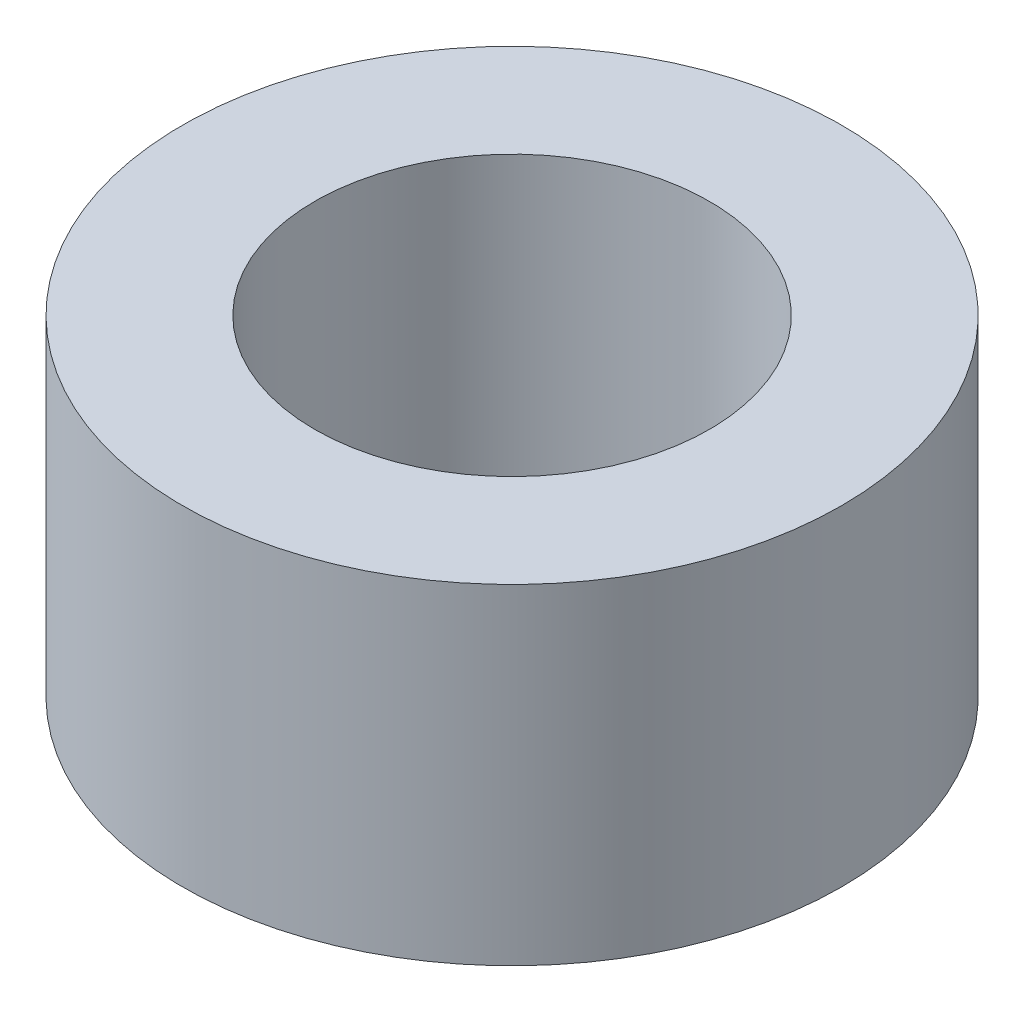
ISO-10303-21;
HEADER;
FILE_DESCRIPTION(('STEP AP214'),'2;1');
FILE_NAME('part.step','',(''),(''),'','','');
FILE_SCHEMA(('AUTOMOTIVE_DESIGN { 1 0 10303 214 1 1 1 1 }'));
ENDSEC;
DATA;
#1=APPLICATION_CONTEXT('core data for automotive mechanical design processes');
#2=APPLICATION_PROTOCOL_DEFINITION('international standard','automotive_design',2000,#1);
#3=PRODUCT_CONTEXT('',#1,'mechanical');
#4=PRODUCT('Part','Part','',(#3));
#5=PRODUCT_RELATED_PRODUCT_CATEGORY('part','',(#4));
#6=PRODUCT_DEFINITION_FORMATION('','',#4);
#7=PRODUCT_DEFINITION_CONTEXT('part definition',#1,'design');
#8=PRODUCT_DEFINITION('design','',#6,#7);
#9=PRODUCT_DEFINITION_SHAPE('','',#8);
#10=(LENGTH_UNIT() NAMED_UNIT(*) SI_UNIT(.MILLI.,.METRE.));
#11=(NAMED_UNIT(*) PLANE_ANGLE_UNIT() SI_UNIT($,.RADIAN.));
#12=(NAMED_UNIT(*) SI_UNIT($,.STERADIAN.) SOLID_ANGLE_UNIT());
#13=UNCERTAINTY_MEASURE_WITH_UNIT(LENGTH_MEASURE(1.E-05),#10,'distance_accuracy_value','');
#14=(GEOMETRIC_REPRESENTATION_CONTEXT(3) GLOBAL_UNCERTAINTY_ASSIGNED_CONTEXT((#13)) GLOBAL_UNIT_ASSIGNED_CONTEXT((#10,
#11,#12)) REPRESENTATION_CONTEXT('',''));
#15=CARTESIAN_POINT('',(0.,0.,0.));
#16=DIRECTION('',(0.,0.,1.));
#17=DIRECTION('',(1.,0.,0.));
#18=AXIS2_PLACEMENT_3D('',#15,#16,#17);
#19=CARTESIAN_POINT('',(0.,2.5,0.));
#20=DIRECTION('',(0.,1.,0.));
#21=DIRECTION('',(0.,0.,1.));
#22=AXIS2_PLACEMENT_3D('',#19,#20,#21);
#23=PLANE('',#22);
#24=CARTESIAN_POINT('',(0.,2.5,0.));
#25=DIRECTION('',(0.,1.,0.));
#26=DIRECTION('',(1.,0.,0.));
#27=AXIS2_PLACEMENT_3D('',#24,#25,#26);
#28=CIRCLE('',#27,2.495);
#29=CARTESIAN_POINT('',(2.495,2.5,0.));
#30=VERTEX_POINT('',#29);
#31=EDGE_CURVE('E11',#30,#30,#28,.T.);
#32=ORIENTED_EDGE('',*,*,#31,.T.);
#33=EDGE_LOOP('',(#32));
#34=FACE_BOUND('',#33,.T.);
#35=CARTESIAN_POINT('',(0.,2.5,0.));
#36=DIRECTION('',(0.,1.,0.));
#37=DIRECTION('',(0.,0.,1.));
#38=AXIS2_PLACEMENT_3D('',#35,#36,#37);
#39=CIRCLE('',#38,1.495);
#40=CARTESIAN_POINT('',(0.,2.5,1.495));
#41=VERTEX_POINT('',#40);
#42=EDGE_CURVE('E47',#41,#41,#39,.T.);
#43=ORIENTED_EDGE('',*,*,#42,.F.);
#44=EDGE_LOOP('',(#43));
#45=FACE_BOUND('',#44,.T.);
#46=ADVANCED_FACE('F36',(#34,#45),#23,.T.);
#47=CARTESIAN_POINT('',(0.,0.,0.));
#48=DIRECTION('',(0.,1.,0.));
#49=DIRECTION('',(0.,0.,1.));
#50=AXIS2_PLACEMENT_3D('',#47,#48,#49);
#51=PLANE('',#50);
#52=CARTESIAN_POINT('',(0.,0.,0.));
#53=DIRECTION('',(0.,1.,0.));
#54=DIRECTION('',(1.,0.,0.));
#55=AXIS2_PLACEMENT_3D('',#52,#53,#54);
#56=CIRCLE('',#55,2.495);
#57=CARTESIAN_POINT('',(2.495,0.,0.));
#58=VERTEX_POINT('',#57);
#59=EDGE_CURVE('E40',#58,#58,#56,.T.);
#60=ORIENTED_EDGE('',*,*,#59,.F.);
#61=EDGE_LOOP('',(#60));
#62=FACE_BOUND('',#61,.T.);
#63=CARTESIAN_POINT('',(0.,0.,0.));
#64=DIRECTION('',(0.,1.,0.));
#65=DIRECTION('',(0.,0.,1.));
#66=AXIS2_PLACEMENT_3D('',#63,#64,#65);
#67=CIRCLE('',#66,1.495);
#68=CARTESIAN_POINT('',(0.,0.,1.495));
#69=VERTEX_POINT('',#68);
#70=EDGE_CURVE('E49',#69,#69,#67,.T.);
#71=ORIENTED_EDGE('',*,*,#70,.T.);
#72=EDGE_LOOP('',(#71));
#73=FACE_BOUND('',#72,.T.);
#74=ADVANCED_FACE('F59',(#62,#73),#51,.F.);
#75=CARTESIAN_POINT('',(0.,2.5,0.));
#76=DIRECTION('',(0.,-1.,0.));
#77=DIRECTION('',(0.,0.,-1.));
#78=AXIS2_PLACEMENT_3D('',#75,#76,#77);
#79=CYLINDRICAL_SURFACE('',#78,2.495);
#80=ORIENTED_EDGE('',*,*,#31,.F.);
#81=EDGE_LOOP('',(#80));
#82=FACE_BOUND('',#81,.T.);
#83=ORIENTED_EDGE('',*,*,#59,.T.);
#84=EDGE_LOOP('',(#83));
#85=FACE_BOUND('',#84,.T.);
#86=ADVANCED_FACE('F38',(#82,#85),#79,.T.);
#87=CARTESIAN_POINT('',(0.,2.5,0.));
#88=DIRECTION('',(0.,-1.,0.));
#89=DIRECTION('',(0.,0.,-1.));
#90=AXIS2_PLACEMENT_3D('',#87,#88,#89);
#91=CYLINDRICAL_SURFACE('',#90,1.495);
#92=ORIENTED_EDGE('',*,*,#42,.T.);
#93=EDGE_LOOP('',(#92));
#94=FACE_BOUND('',#93,.T.);
#95=ORIENTED_EDGE('',*,*,#70,.F.);
#96=EDGE_LOOP('',(#95));
#97=FACE_BOUND('',#96,.T.);
#98=ADVANCED_FACE('F55',(#94,#97),#91,.F.);
#99=CLOSED_SHELL('',(#46,#74,#86,#98));
#100=MANIFOLD_SOLID_BREP('B2',#99);
#101=ADVANCED_BREP_SHAPE_REPRESENTATION('',(#18,#100),#14);
#102=SHAPE_DEFINITION_REPRESENTATION(#9,#101);
ENDSEC;
END-ISO-10303-21;
